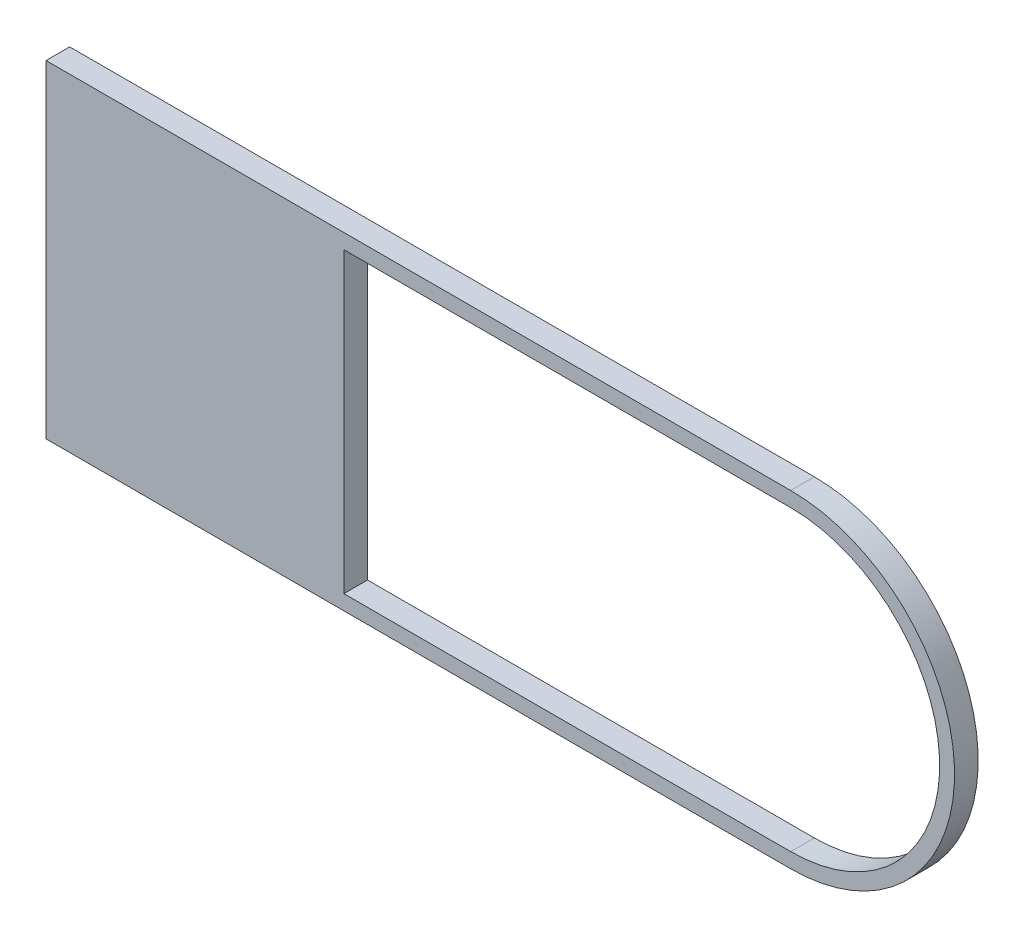
ISO-10303-21;
HEADER;
FILE_DESCRIPTION(('STEP AP214'),'2;1');
FILE_NAME('part.step','',(''),(''),'','','');
FILE_SCHEMA(('AUTOMOTIVE_DESIGN { 1 0 10303 214 1 1 1 1 }'));
ENDSEC;
DATA;
#1=APPLICATION_CONTEXT('core data for automotive mechanical design processes');
#2=APPLICATION_PROTOCOL_DEFINITION('international standard','automotive_design',2000,#1);
#3=PRODUCT_CONTEXT('',#1,'mechanical');
#4=PRODUCT('Part','Part','',(#3));
#5=PRODUCT_RELATED_PRODUCT_CATEGORY('part','',(#4));
#6=PRODUCT_DEFINITION_FORMATION('','',#4);
#7=PRODUCT_DEFINITION_CONTEXT('part definition',#1,'design');
#8=PRODUCT_DEFINITION('design','',#6,#7);
#9=PRODUCT_DEFINITION_SHAPE('','',#8);
#10=(LENGTH_UNIT() NAMED_UNIT(*) SI_UNIT(.MILLI.,.METRE.));
#11=(NAMED_UNIT(*) PLANE_ANGLE_UNIT() SI_UNIT($,.RADIAN.));
#12=(NAMED_UNIT(*) SI_UNIT($,.STERADIAN.) SOLID_ANGLE_UNIT());
#13=UNCERTAINTY_MEASURE_WITH_UNIT(LENGTH_MEASURE(1.E-05),#10,'distance_accuracy_value','');
#14=(GEOMETRIC_REPRESENTATION_CONTEXT(3) GLOBAL_UNCERTAINTY_ASSIGNED_CONTEXT((#13)) GLOBAL_UNIT_ASSIGNED_CONTEXT((#10,
#11,#12)) REPRESENTATION_CONTEXT('',''));
#15=CARTESIAN_POINT('',(0.,0.,0.));
#16=DIRECTION('',(0.,0.,1.));
#17=DIRECTION('',(1.,0.,0.));
#18=AXIS2_PLACEMENT_3D('',#15,#16,#17);
#19=CARTESIAN_POINT('',(100.,22.,3.175));
#20=DIRECTION('',(0.,0.,-1.));
#21=DIRECTION('',(-1.,0.,0.));
#22=AXIS2_PLACEMENT_3D('',#19,#20,#21);
#23=PLANE('',#22);
#24=DIRECTION('',(0.,-1.,0.));
#25=VECTOR('',#24,1.);
#26=CARTESIAN_POINT('',(0.,0.,3.175));
#27=LINE('',#26,#25);
#28=CARTESIAN_POINT('',(0.,44.,3.175));
#29=VERTEX_POINT('',#28);
#30=CARTESIAN_POINT('',(0.,0.,3.175));
#31=VERTEX_POINT('',#30);
#32=EDGE_CURVE('E135',#29,#31,#27,.T.);
#33=ORIENTED_EDGE('',*,*,#32,.T.);
#34=DIRECTION('',(1.,0.,0.));
#35=VECTOR('',#34,1.);
#36=CARTESIAN_POINT('',(0.,0.,3.175));
#37=LINE('',#36,#35);
#38=CARTESIAN_POINT('',(100.,0.,3.175));
#39=VERTEX_POINT('',#38);
#40=EDGE_CURVE('E138',#31,#39,#37,.T.);
#41=ORIENTED_EDGE('',*,*,#40,.T.);
#42=CARTESIAN_POINT('',(100.,22.,3.175));
#43=DIRECTION('',(0.,0.,1.));
#44=DIRECTION('',(-1.,0.,0.));
#45=AXIS2_PLACEMENT_3D('',#42,#43,#44);
#46=CIRCLE('',#45,22.);
#47=CARTESIAN_POINT('',(100.,44.,3.175));
#48=VERTEX_POINT('',#47);
#49=EDGE_CURVE('E141',#39,#48,#46,.T.);
#50=ORIENTED_EDGE('',*,*,#49,.T.);
#51=DIRECTION('',(-1.,0.,0.));
#52=VECTOR('',#51,1.);
#53=CARTESIAN_POINT('',(0.,44.,3.175));
#54=LINE('',#53,#52);
#55=EDGE_CURVE('E143',#48,#29,#54,.T.);
#56=ORIENTED_EDGE('',*,*,#55,.T.);
#57=EDGE_LOOP('',(#33,#41,#50,#56));
#58=FACE_BOUND('',#57,.T.);
#59=DIRECTION('',(1.,0.,0.));
#60=VECTOR('',#59,1.);
#61=CARTESIAN_POINT('',(40.,2.00000000000001,3.175));
#62=LINE('',#61,#60);
#63=CARTESIAN_POINT('',(40.,2.00000000000001,3.175));
#64=VERTEX_POINT('',#63);
#65=CARTESIAN_POINT('',(100.,2.,3.175));
#66=VERTEX_POINT('',#65);
#67=EDGE_CURVE('E99',#64,#66,#62,.T.);
#68=ORIENTED_EDGE('',*,*,#67,.F.);
#69=DIRECTION('',(0.,-1.,0.));
#70=VECTOR('',#69,1.);
#71=CARTESIAN_POINT('',(40.,2.00000000000001,3.175));
#72=LINE('',#71,#70);
#73=CARTESIAN_POINT('',(40.,42.,3.175));
#74=VERTEX_POINT('',#73);
#75=EDGE_CURVE('E121',#74,#64,#72,.T.);
#76=ORIENTED_EDGE('',*,*,#75,.F.);
#77=DIRECTION('',(-1.,0.,0.));
#78=VECTOR('',#77,1.);
#79=CARTESIAN_POINT('',(40.,42.,3.175));
#80=LINE('',#79,#78);
#81=CARTESIAN_POINT('',(100.,42.,3.175));
#82=VERTEX_POINT('',#81);
#83=EDGE_CURVE('E119',#82,#74,#80,.T.);
#84=ORIENTED_EDGE('',*,*,#83,.F.);
#85=CARTESIAN_POINT('',(100.,22.,3.175));
#86=DIRECTION('',(0.,0.,1.));
#87=DIRECTION('',(1.,0.,0.));
#88=AXIS2_PLACEMENT_3D('',#85,#86,#87);
#89=CIRCLE('',#88,20.);
#90=EDGE_CURVE('E107',#66,#82,#89,.T.);
#91=ORIENTED_EDGE('',*,*,#90,.F.);
#92=EDGE_LOOP('',(#68,#76,#84,#91));
#93=FACE_BOUND('',#92,.T.);
#94=ADVANCED_FACE('F34',(#58,#93),#23,.F.);
#95=CARTESIAN_POINT('',(100.,22.,0.));
#96=DIRECTION('',(0.,0.,-1.));
#97=DIRECTION('',(-1.,0.,0.));
#98=AXIS2_PLACEMENT_3D('',#95,#96,#97);
#99=PLANE('',#98);
#100=DIRECTION('',(0.,-1.,0.));
#101=VECTOR('',#100,1.);
#102=CARTESIAN_POINT('',(0.,0.,0.));
#103=LINE('',#102,#101);
#104=CARTESIAN_POINT('',(0.,44.,0.));
#105=VERTEX_POINT('',#104);
#106=CARTESIAN_POINT('',(0.,0.,0.));
#107=VERTEX_POINT('',#106);
#108=EDGE_CURVE('E115',#105,#107,#103,.T.);
#109=ORIENTED_EDGE('',*,*,#108,.F.);
#110=DIRECTION('',(-1.,0.,0.));
#111=VECTOR('',#110,1.);
#112=CARTESIAN_POINT('',(0.,44.,0.));
#113=LINE('',#112,#111);
#114=CARTESIAN_POINT('',(100.,44.,0.));
#115=VERTEX_POINT('',#114);
#116=EDGE_CURVE('E139',#115,#105,#113,.T.);
#117=ORIENTED_EDGE('',*,*,#116,.F.);
#118=CARTESIAN_POINT('',(100.,22.,0.));
#119=DIRECTION('',(0.,0.,1.));
#120=DIRECTION('',(-1.,0.,0.));
#121=AXIS2_PLACEMENT_3D('',#118,#119,#120);
#122=CIRCLE('',#121,22.);
#123=CARTESIAN_POINT('',(100.,0.,0.));
#124=VERTEX_POINT('',#123);
#125=EDGE_CURVE('E150',#124,#115,#122,.T.);
#126=ORIENTED_EDGE('',*,*,#125,.F.);
#127=DIRECTION('',(1.,0.,0.));
#128=VECTOR('',#127,1.);
#129=CARTESIAN_POINT('',(0.,0.,0.));
#130=LINE('',#129,#128);
#131=EDGE_CURVE('E148',#107,#124,#130,.T.);
#132=ORIENTED_EDGE('',*,*,#131,.F.);
#133=EDGE_LOOP('',(#109,#117,#126,#132));
#134=FACE_BOUND('',#133,.T.);
#135=DIRECTION('',(0.,-1.,0.));
#136=VECTOR('',#135,1.);
#137=CARTESIAN_POINT('',(40.,2.00000000000001,0.));
#138=LINE('',#137,#136);
#139=CARTESIAN_POINT('',(40.,42.,0.));
#140=VERTEX_POINT('',#139);
#141=CARTESIAN_POINT('',(40.,2.00000000000001,0.));
#142=VERTEX_POINT('',#141);
#143=EDGE_CURVE('E108',#140,#142,#138,.T.);
#144=ORIENTED_EDGE('',*,*,#143,.T.);
#145=DIRECTION('',(1.,0.,0.));
#146=VECTOR('',#145,1.);
#147=CARTESIAN_POINT('',(40.,2.00000000000001,0.));
#148=LINE('',#147,#146);
#149=CARTESIAN_POINT('',(100.,2.,0.));
#150=VERTEX_POINT('',#149);
#151=EDGE_CURVE('E57',#142,#150,#148,.T.);
#152=ORIENTED_EDGE('',*,*,#151,.T.);
#153=CARTESIAN_POINT('',(100.,22.,0.));
#154=DIRECTION('',(0.,0.,1.));
#155=DIRECTION('',(1.,0.,0.));
#156=AXIS2_PLACEMENT_3D('',#153,#154,#155);
#157=CIRCLE('',#156,20.);
#158=CARTESIAN_POINT('',(100.,42.,0.));
#159=VERTEX_POINT('',#158);
#160=EDGE_CURVE('E114',#150,#159,#157,.T.);
#161=ORIENTED_EDGE('',*,*,#160,.T.);
#162=DIRECTION('',(-1.,0.,0.));
#163=VECTOR('',#162,1.);
#164=CARTESIAN_POINT('',(40.,42.,0.));
#165=LINE('',#164,#163);
#166=EDGE_CURVE('E127',#159,#140,#165,.T.);
#167=ORIENTED_EDGE('',*,*,#166,.T.);
#168=EDGE_LOOP('',(#144,#152,#161,#167));
#169=FACE_BOUND('',#168,.T.);
#170=ADVANCED_FACE('F168',(#134,#169),#99,.T.);
#171=CARTESIAN_POINT('',(0.,0.,3.175));
#172=DIRECTION('',(1.,0.,0.));
#173=DIRECTION('',(0.,0.,-1.));
#174=AXIS2_PLACEMENT_3D('',#171,#172,#173);
#175=PLANE('',#174);
#176=ORIENTED_EDGE('',*,*,#108,.T.);
#177=DIRECTION('',(0.,0.,-1.));
#178=VECTOR('',#177,1.);
#179=CARTESIAN_POINT('',(0.,0.,3.175));
#180=LINE('',#179,#178);
#181=EDGE_CURVE('E11',#31,#107,#180,.T.);
#182=ORIENTED_EDGE('',*,*,#181,.F.);
#183=ORIENTED_EDGE('',*,*,#32,.F.);
#184=DIRECTION('',(0.,0.,-1.));
#185=VECTOR('',#184,1.);
#186=CARTESIAN_POINT('',(0.,44.,3.175));
#187=LINE('',#186,#185);
#188=EDGE_CURVE('E145',#29,#105,#187,.T.);
#189=ORIENTED_EDGE('',*,*,#188,.T.);
#190=EDGE_LOOP('',(#176,#182,#183,#189));
#191=FACE_BOUND('',#190,.T.);
#192=ADVANCED_FACE('F36',(#191),#175,.F.);
#193=CARTESIAN_POINT('',(0.,0.,3.175));
#194=DIRECTION('',(0.,1.,0.));
#195=DIRECTION('',(0.,0.,1.));
#196=AXIS2_PLACEMENT_3D('',#193,#194,#195);
#197=PLANE('',#196);
#198=ORIENTED_EDGE('',*,*,#131,.T.);
#199=DIRECTION('',(0.,0.,-1.));
#200=VECTOR('',#199,1.);
#201=CARTESIAN_POINT('',(100.,0.,3.175));
#202=LINE('',#201,#200);
#203=EDGE_CURVE('E42',#39,#124,#202,.T.);
#204=ORIENTED_EDGE('',*,*,#203,.F.);
#205=ORIENTED_EDGE('',*,*,#40,.F.);
#206=ORIENTED_EDGE('',*,*,#181,.T.);
#207=EDGE_LOOP('',(#198,#204,#205,#206));
#208=FACE_BOUND('',#207,.T.);
#209=ADVANCED_FACE('F178',(#208),#197,.F.);
#210=CARTESIAN_POINT('',(100.,22.,3.175));
#211=DIRECTION('',(0.,0.,-1.));
#212=DIRECTION('',(-1.,0.,0.));
#213=AXIS2_PLACEMENT_3D('',#210,#211,#212);
#214=CYLINDRICAL_SURFACE('',#213,22.);
#215=ORIENTED_EDGE('',*,*,#125,.T.);
#216=DIRECTION('',(0.,0.,-1.));
#217=VECTOR('',#216,1.);
#218=CARTESIAN_POINT('',(100.,44.,3.175));
#219=LINE('',#218,#217);
#220=EDGE_CURVE('E155',#48,#115,#219,.T.);
#221=ORIENTED_EDGE('',*,*,#220,.F.);
#222=ORIENTED_EDGE('',*,*,#49,.F.);
#223=ORIENTED_EDGE('',*,*,#203,.T.);
#224=EDGE_LOOP('',(#215,#221,#222,#223));
#225=FACE_BOUND('',#224,.T.);
#226=ADVANCED_FACE('F162',(#225),#214,.T.);
#227=CARTESIAN_POINT('',(0.,44.,3.175));
#228=DIRECTION('',(0.,-1.,0.));
#229=DIRECTION('',(0.,0.,-1.));
#230=AXIS2_PLACEMENT_3D('',#227,#228,#229);
#231=PLANE('',#230);
#232=ORIENTED_EDGE('',*,*,#116,.T.);
#233=ORIENTED_EDGE('',*,*,#188,.F.);
#234=ORIENTED_EDGE('',*,*,#55,.F.);
#235=ORIENTED_EDGE('',*,*,#220,.T.);
#236=EDGE_LOOP('',(#232,#233,#234,#235));
#237=FACE_BOUND('',#236,.T.);
#238=ADVANCED_FACE('F172',(#237),#231,.F.);
#239=CARTESIAN_POINT('',(40.,2.00000000000001,3.175));
#240=DIRECTION('',(0.,1.,0.));
#241=DIRECTION('',(-1.,0.,0.));
#242=AXIS2_PLACEMENT_3D('',#239,#240,#241);
#243=PLANE('',#242);
#244=ORIENTED_EDGE('',*,*,#151,.F.);
#245=DIRECTION('',(0.,0.,-1.));
#246=VECTOR('',#245,1.);
#247=CARTESIAN_POINT('',(40.,2.00000000000001,3.175));
#248=LINE('',#247,#246);
#249=EDGE_CURVE('E103',#64,#142,#248,.T.);
#250=ORIENTED_EDGE('',*,*,#249,.F.);
#251=ORIENTED_EDGE('',*,*,#67,.T.);
#252=DIRECTION('',(0.,0.,-1.));
#253=VECTOR('',#252,1.);
#254=CARTESIAN_POINT('',(100.,2.,3.175));
#255=LINE('',#254,#253);
#256=EDGE_CURVE('E102',#66,#150,#255,.T.);
#257=ORIENTED_EDGE('',*,*,#256,.T.);
#258=EDGE_LOOP('',(#244,#250,#251,#257));
#259=FACE_BOUND('',#258,.T.);
#260=ADVANCED_FACE('F101',(#259),#243,.T.);
#261=CARTESIAN_POINT('',(100.,22.,3.175));
#262=DIRECTION('',(0.,0.,-1.));
#263=DIRECTION('',(-1.,0.,0.));
#264=AXIS2_PLACEMENT_3D('',#261,#262,#263);
#265=CYLINDRICAL_SURFACE('',#264,20.);
#266=ORIENTED_EDGE('',*,*,#160,.F.);
#267=ORIENTED_EDGE('',*,*,#256,.F.);
#268=ORIENTED_EDGE('',*,*,#90,.T.);
#269=DIRECTION('',(0.,0.,-1.));
#270=VECTOR('',#269,1.);
#271=CARTESIAN_POINT('',(100.,42.,3.175));
#272=LINE('',#271,#270);
#273=EDGE_CURVE('E116',#82,#159,#272,.T.);
#274=ORIENTED_EDGE('',*,*,#273,.T.);
#275=EDGE_LOOP('',(#266,#267,#268,#274));
#276=FACE_BOUND('',#275,.T.);
#277=ADVANCED_FACE('F111',(#276),#265,.F.);
#278=CARTESIAN_POINT('',(40.,42.,3.175));
#279=DIRECTION('',(0.,-1.,0.));
#280=DIRECTION('',(1.,0.,0.));
#281=AXIS2_PLACEMENT_3D('',#278,#279,#280);
#282=PLANE('',#281);
#283=ORIENTED_EDGE('',*,*,#166,.F.);
#284=ORIENTED_EDGE('',*,*,#273,.F.);
#285=ORIENTED_EDGE('',*,*,#83,.T.);
#286=DIRECTION('',(0.,0.,-1.));
#287=VECTOR('',#286,1.);
#288=CARTESIAN_POINT('',(40.,42.,3.175));
#289=LINE('',#288,#287);
#290=EDGE_CURVE('E49',#74,#140,#289,.T.);
#291=ORIENTED_EDGE('',*,*,#290,.T.);
#292=EDGE_LOOP('',(#283,#284,#285,#291));
#293=FACE_BOUND('',#292,.T.);
#294=ADVANCED_FACE('F201',(#293),#282,.T.);
#295=CARTESIAN_POINT('',(40.,2.00000000000001,3.175));
#296=DIRECTION('',(1.,0.,0.));
#297=DIRECTION('',(0.,1.,0.));
#298=AXIS2_PLACEMENT_3D('',#295,#296,#297);
#299=PLANE('',#298);
#300=ORIENTED_EDGE('',*,*,#143,.F.);
#301=ORIENTED_EDGE('',*,*,#290,.F.);
#302=ORIENTED_EDGE('',*,*,#75,.T.);
#303=ORIENTED_EDGE('',*,*,#249,.T.);
#304=EDGE_LOOP('',(#300,#301,#302,#303));
#305=FACE_BOUND('',#304,.T.);
#306=ADVANCED_FACE('F205',(#305),#299,.T.);
#307=CLOSED_SHELL('',(#94,#170,#192,#209,#226,#238,#260,#277,#294,#306));
#308=MANIFOLD_SOLID_BREP('B2',#307);
#309=ADVANCED_BREP_SHAPE_REPRESENTATION('',(#18,#308),#14);
#310=SHAPE_DEFINITION_REPRESENTATION(#9,#309);
ENDSEC;
END-ISO-10303-21;
